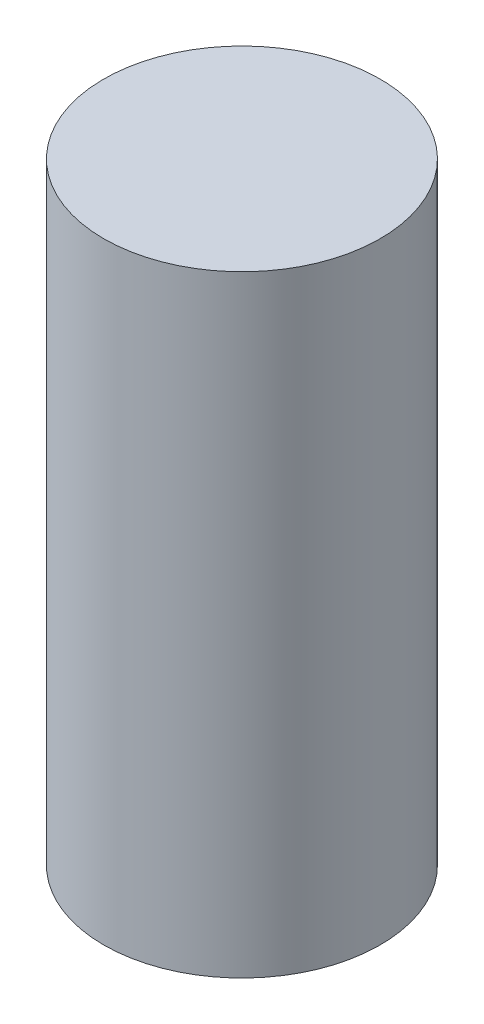
ISO-10303-21;
HEADER;
FILE_DESCRIPTION(('STEP AP214'),'2;1');
FILE_NAME('part.step','',(''),(''),'','','');
FILE_SCHEMA(('AUTOMOTIVE_DESIGN { 1 0 10303 214 1 1 1 1 }'));
ENDSEC;
DATA;
#1=APPLICATION_CONTEXT('core data for automotive mechanical design processes');
#2=APPLICATION_PROTOCOL_DEFINITION('international standard','automotive_design',2000,#1);
#3=PRODUCT_CONTEXT('',#1,'mechanical');
#4=PRODUCT('Part','Part','',(#3));
#5=PRODUCT_RELATED_PRODUCT_CATEGORY('part','',(#4));
#6=PRODUCT_DEFINITION_FORMATION('','',#4);
#7=PRODUCT_DEFINITION_CONTEXT('part definition',#1,'design');
#8=PRODUCT_DEFINITION('design','',#6,#7);
#9=PRODUCT_DEFINITION_SHAPE('','',#8);
#10=(LENGTH_UNIT() NAMED_UNIT(*) SI_UNIT(.MILLI.,.METRE.));
#11=(NAMED_UNIT(*) PLANE_ANGLE_UNIT() SI_UNIT($,.RADIAN.));
#12=(NAMED_UNIT(*) SI_UNIT($,.STERADIAN.) SOLID_ANGLE_UNIT());
#13=UNCERTAINTY_MEASURE_WITH_UNIT(LENGTH_MEASURE(1.E-05),#10,'distance_accuracy_value','');
#14=(GEOMETRIC_REPRESENTATION_CONTEXT(3) GLOBAL_UNCERTAINTY_ASSIGNED_CONTEXT((#13)) GLOBAL_UNIT_ASSIGNED_CONTEXT((#10,
#11,#12)) REPRESENTATION_CONTEXT('',''));
#15=CARTESIAN_POINT('',(0.,0.,0.));
#16=DIRECTION('',(0.,0.,1.));
#17=DIRECTION('',(1.,0.,0.));
#18=AXIS2_PLACEMENT_3D('',#15,#16,#17);
#19=CARTESIAN_POINT('',(0.,146.,0.));
#20=DIRECTION('',(0.,-1.,0.));
#21=DIRECTION('',(0.,0.,-1.));
#22=AXIS2_PLACEMENT_3D('',#19,#20,#21);
#23=CYLINDRICAL_SURFACE('',#22,33.);
#24=CARTESIAN_POINT('',(0.,146.,0.));
#25=DIRECTION('',(0.,1.,0.));
#26=DIRECTION('',(0.,0.,1.));
#27=AXIS2_PLACEMENT_3D('',#24,#25,#26);
#28=CIRCLE('',#27,33.);
#29=CARTESIAN_POINT('',(0.,146.,33.));
#30=VERTEX_POINT('',#29);
#31=EDGE_CURVE('E10',#30,#30,#28,.T.);
#32=ORIENTED_EDGE('',*,*,#31,.F.);
#33=EDGE_LOOP('',(#32));
#34=FACE_BOUND('',#33,.T.);
#35=CARTESIAN_POINT('',(0.,0.,0.));
#36=DIRECTION('',(0.,1.,0.));
#37=DIRECTION('',(0.,0.,1.));
#38=AXIS2_PLACEMENT_3D('',#35,#36,#37);
#39=CIRCLE('',#38,33.);
#40=CARTESIAN_POINT('',(0.,0.,33.));
#41=VERTEX_POINT('',#40);
#42=EDGE_CURVE('E34',#41,#41,#39,.T.);
#43=ORIENTED_EDGE('',*,*,#42,.T.);
#44=EDGE_LOOP('',(#43));
#45=FACE_BOUND('',#44,.T.);
#46=ADVANCED_FACE('F31',(#34,#45),#23,.T.);
#47=CARTESIAN_POINT('',(0.,146.,0.));
#48=DIRECTION('',(0.,1.,0.));
#49=DIRECTION('',(0.,0.,1.));
#50=AXIS2_PLACEMENT_3D('',#47,#48,#49);
#51=PLANE('',#50);
#52=ORIENTED_EDGE('',*,*,#31,.T.);
#53=EDGE_LOOP('',(#52));
#54=FACE_BOUND('',#53,.T.);
#55=ADVANCED_FACE('F46',(#54),#51,.T.);
#56=CARTESIAN_POINT('',(0.,0.,0.));
#57=DIRECTION('',(0.,1.,0.));
#58=DIRECTION('',(0.,0.,1.));
#59=AXIS2_PLACEMENT_3D('',#56,#57,#58);
#60=PLANE('',#59);
#61=ORIENTED_EDGE('',*,*,#42,.F.);
#62=EDGE_LOOP('',(#61));
#63=FACE_BOUND('',#62,.T.);
#64=ADVANCED_FACE('F44',(#63),#60,.F.);
#65=CLOSED_SHELL('',(#46,#55,#64));
#66=MANIFOLD_SOLID_BREP('B2',#65);
#67=ADVANCED_BREP_SHAPE_REPRESENTATION('',(#18,#66),#14);
#68=SHAPE_DEFINITION_REPRESENTATION(#9,#67);
ENDSEC;
END-ISO-10303-21;
